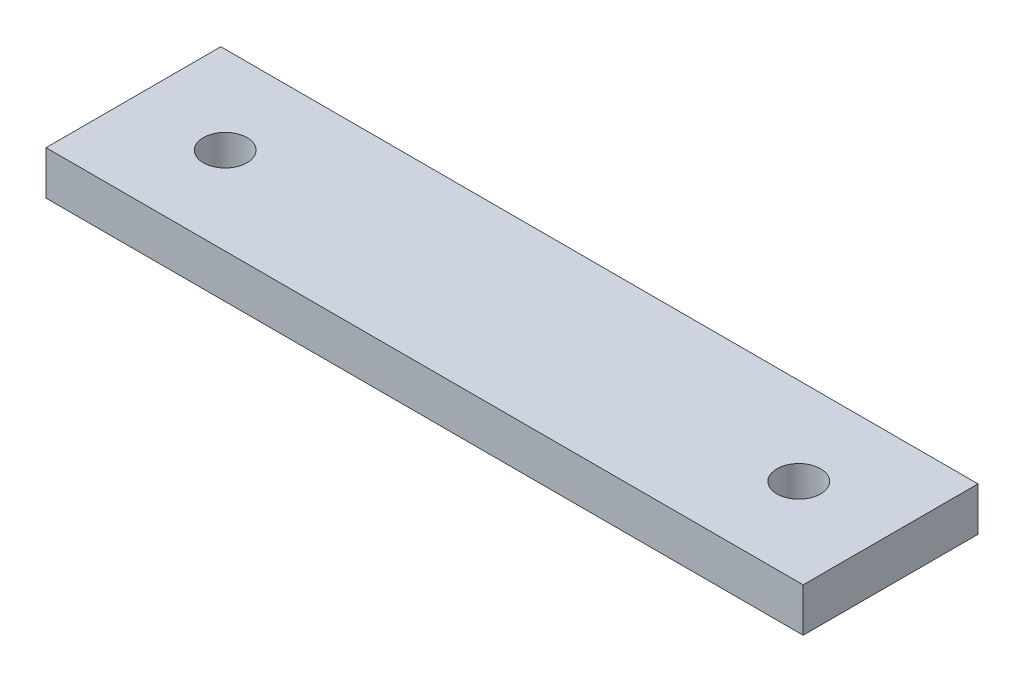
ISO-10303-21;
HEADER;
FILE_DESCRIPTION(('STEP AP214'),'2;1');
FILE_NAME('part.step','',(''),(''),'','','');
FILE_SCHEMA(('AUTOMOTIVE_DESIGN { 1 0 10303 214 1 1 1 1 }'));
ENDSEC;
DATA;
#1=APPLICATION_CONTEXT('core data for automotive mechanical design processes');
#2=APPLICATION_PROTOCOL_DEFINITION('international standard','automotive_design',2000,#1);
#3=PRODUCT_CONTEXT('',#1,'mechanical');
#4=PRODUCT('Part','Part','',(#3));
#5=PRODUCT_RELATED_PRODUCT_CATEGORY('part','',(#4));
#6=PRODUCT_DEFINITION_FORMATION('','',#4);
#7=PRODUCT_DEFINITION_CONTEXT('part definition',#1,'design');
#8=PRODUCT_DEFINITION('design','',#6,#7);
#9=PRODUCT_DEFINITION_SHAPE('','',#8);
#10=(LENGTH_UNIT() NAMED_UNIT(*) SI_UNIT(.MILLI.,.METRE.));
#11=(NAMED_UNIT(*) PLANE_ANGLE_UNIT() SI_UNIT($,.RADIAN.));
#12=(NAMED_UNIT(*) SI_UNIT($,.STERADIAN.) SOLID_ANGLE_UNIT());
#13=UNCERTAINTY_MEASURE_WITH_UNIT(LENGTH_MEASURE(1.E-05),#10,'distance_accuracy_value','');
#14=(GEOMETRIC_REPRESENTATION_CONTEXT(3) GLOBAL_UNCERTAINTY_ASSIGNED_CONTEXT((#13)) GLOBAL_UNIT_ASSIGNED_CONTEXT((#10,
#11,#12)) REPRESENTATION_CONTEXT('',''));
#15=CARTESIAN_POINT('',(0.,0.,0.));
#16=DIRECTION('',(0.,0.,1.));
#17=DIRECTION('',(1.,0.,0.));
#18=AXIS2_PLACEMENT_3D('',#15,#16,#17);
#19=CARTESIAN_POINT('',(0.,19.05,0.));
#20=DIRECTION('',(0.,-1.,0.));
#21=DIRECTION('',(0.,0.,-1.));
#22=AXIS2_PLACEMENT_3D('',#19,#20,#21);
#23=PLANE('',#22);
#24=DIRECTION('',(0.,0.,-1.));
#25=VECTOR('',#24,1.);
#26=CARTESIAN_POINT('',(165.,19.05,38.1));
#27=LINE('',#26,#25);
#28=CARTESIAN_POINT('',(165.,19.05,38.1));
#29=VERTEX_POINT('',#28);
#30=CARTESIAN_POINT('',(165.,19.05,-38.0999999999999));
#31=VERTEX_POINT('',#30);
#32=EDGE_CURVE('E97',#29,#31,#27,.T.);
#33=ORIENTED_EDGE('',*,*,#32,.T.);
#34=DIRECTION('',(-1.,0.,0.));
#35=VECTOR('',#34,1.);
#36=CARTESIAN_POINT('',(-165.,19.05,-38.1));
#37=LINE('',#36,#35);
#38=CARTESIAN_POINT('',(-165.,19.05,-38.1));
#39=VERTEX_POINT('',#38);
#40=EDGE_CURVE('E93',#31,#39,#37,.T.);
#41=ORIENTED_EDGE('',*,*,#40,.T.);
#42=DIRECTION('',(0.,0.,1.));
#43=VECTOR('',#42,1.);
#44=CARTESIAN_POINT('',(-165.,19.05,38.1));
#45=LINE('',#44,#43);
#46=CARTESIAN_POINT('',(-165.,19.05,38.1));
#47=VERTEX_POINT('',#46);
#48=EDGE_CURVE('E96',#39,#47,#45,.T.);
#49=ORIENTED_EDGE('',*,*,#48,.T.);
#50=DIRECTION('',(1.,0.,0.));
#51=VECTOR('',#50,1.);
#52=CARTESIAN_POINT('',(-165.,19.05,38.1));
#53=LINE('',#52,#51);
#54=EDGE_CURVE('E64',#47,#29,#53,.T.);
#55=ORIENTED_EDGE('',*,*,#54,.T.);
#56=EDGE_LOOP('',(#33,#41,#49,#55));
#57=FACE_BOUND('',#56,.T.);
#58=CARTESIAN_POINT('',(-125.,19.05,0.));
#59=DIRECTION('',(0.,1.,0.));
#60=DIRECTION('',(0.,0.,1.));
#61=AXIS2_PLACEMENT_3D('',#58,#59,#60);
#62=CIRCLE('',#61,9.52499999999999);
#63=CARTESIAN_POINT('',(-125.,19.05,-9.52499999999999));
#64=VERTEX_POINT('',#63);
#65=EDGE_CURVE('E119',#64,#64,#62,.T.);
#66=ORIENTED_EDGE('',*,*,#65,.F.);
#67=EDGE_LOOP('',(#66));
#68=FACE_BOUND('',#67,.T.);
#69=CARTESIAN_POINT('',(125.,19.05,0.));
#70=DIRECTION('',(0.,1.,0.));
#71=DIRECTION('',(0.,0.,1.));
#72=AXIS2_PLACEMENT_3D('',#69,#70,#71);
#73=CIRCLE('',#72,9.52500000000002);
#74=CARTESIAN_POINT('',(125.,19.05,-9.52500000000001));
#75=VERTEX_POINT('',#74);
#76=EDGE_CURVE('E139',#75,#75,#73,.T.);
#77=ORIENTED_EDGE('',*,*,#76,.F.);
#78=EDGE_LOOP('',(#77));
#79=FACE_BOUND('',#78,.T.);
#80=ADVANCED_FACE('F44',(#57,#68,#79),#23,.F.);
#81=CARTESIAN_POINT('',(0.,0.,0.));
#82=DIRECTION('',(0.,-1.,0.));
#83=DIRECTION('',(0.,0.,-1.));
#84=AXIS2_PLACEMENT_3D('',#81,#82,#83);
#85=PLANE('',#84);
#86=CARTESIAN_POINT('',(-125.,0.,0.));
#87=DIRECTION('',(0.,1.,0.));
#88=DIRECTION('',(0.,0.,1.));
#89=AXIS2_PLACEMENT_3D('',#86,#87,#88);
#90=CIRCLE('',#89,9.52499999999999);
#91=CARTESIAN_POINT('',(-125.,0.,-9.52499999999999));
#92=VERTEX_POINT('',#91);
#93=EDGE_CURVE('E136',#92,#92,#90,.T.);
#94=ORIENTED_EDGE('',*,*,#93,.T.);
#95=EDGE_LOOP('',(#94));
#96=FACE_BOUND('',#95,.T.);
#97=DIRECTION('',(0.,0.,-1.));
#98=VECTOR('',#97,1.);
#99=CARTESIAN_POINT('',(165.,0.,38.1));
#100=LINE('',#99,#98);
#101=CARTESIAN_POINT('',(165.,0.,38.1));
#102=VERTEX_POINT('',#101);
#103=CARTESIAN_POINT('',(165.,0.,-38.0999999999999));
#104=VERTEX_POINT('',#103);
#105=EDGE_CURVE('E114',#102,#104,#100,.T.);
#106=ORIENTED_EDGE('',*,*,#105,.F.);
#107=DIRECTION('',(1.,0.,0.));
#108=VECTOR('',#107,1.);
#109=CARTESIAN_POINT('',(-165.,0.,38.1));
#110=LINE('',#109,#108);
#111=CARTESIAN_POINT('',(-165.,0.,38.1));
#112=VERTEX_POINT('',#111);
#113=EDGE_CURVE('E86',#112,#102,#110,.T.);
#114=ORIENTED_EDGE('',*,*,#113,.F.);
#115=DIRECTION('',(0.,0.,1.));
#116=VECTOR('',#115,1.);
#117=CARTESIAN_POINT('',(-165.,0.,38.1));
#118=LINE('',#117,#116);
#119=CARTESIAN_POINT('',(-165.,0.,-38.1));
#120=VERTEX_POINT('',#119);
#121=EDGE_CURVE('E79',#120,#112,#118,.T.);
#122=ORIENTED_EDGE('',*,*,#121,.F.);
#123=DIRECTION('',(-1.,0.,0.));
#124=VECTOR('',#123,1.);
#125=CARTESIAN_POINT('',(-165.,0.,-38.1));
#126=LINE('',#125,#124);
#127=EDGE_CURVE('E104',#104,#120,#126,.T.);
#128=ORIENTED_EDGE('',*,*,#127,.F.);
#129=EDGE_LOOP('',(#106,#114,#122,#128));
#130=FACE_BOUND('',#129,.T.);
#131=CARTESIAN_POINT('',(125.,0.,0.));
#132=DIRECTION('',(0.,1.,0.));
#133=DIRECTION('',(0.,0.,1.));
#134=AXIS2_PLACEMENT_3D('',#131,#132,#133);
#135=CIRCLE('',#134,9.52500000000002);
#136=CARTESIAN_POINT('',(125.,0.,-9.52500000000001));
#137=VERTEX_POINT('',#136);
#138=EDGE_CURVE('E143',#137,#137,#135,.T.);
#139=ORIENTED_EDGE('',*,*,#138,.T.);
#140=EDGE_LOOP('',(#139));
#141=FACE_BOUND('',#140,.T.);
#142=ADVANCED_FACE('F131',(#96,#130,#141),#85,.T.);
#143=CARTESIAN_POINT('',(165.,19.05,38.1));
#144=DIRECTION('',(-1.,0.,0.));
#145=DIRECTION('',(0.,0.,1.));
#146=AXIS2_PLACEMENT_3D('',#143,#144,#145);
#147=PLANE('',#146);
#148=ORIENTED_EDGE('',*,*,#105,.T.);
#149=DIRECTION('',(0.,-1.,0.));
#150=VECTOR('',#149,1.);
#151=CARTESIAN_POINT('',(165.,19.05,-38.0999999999999));
#152=LINE('',#151,#150);
#153=EDGE_CURVE('E11',#31,#104,#152,.T.);
#154=ORIENTED_EDGE('',*,*,#153,.F.);
#155=ORIENTED_EDGE('',*,*,#32,.F.);
#156=DIRECTION('',(0.,-1.,0.));
#157=VECTOR('',#156,1.);
#158=CARTESIAN_POINT('',(165.,19.05,38.1));
#159=LINE('',#158,#157);
#160=EDGE_CURVE('E110',#29,#102,#159,.T.);
#161=ORIENTED_EDGE('',*,*,#160,.T.);
#162=EDGE_LOOP('',(#148,#154,#155,#161));
#163=FACE_BOUND('',#162,.T.);
#164=ADVANCED_FACE('F50',(#163),#147,.F.);
#165=CARTESIAN_POINT('',(-165.,19.05,-38.1));
#166=DIRECTION('',(0.,0.,1.));
#167=DIRECTION('',(1.,0.,0.));
#168=AXIS2_PLACEMENT_3D('',#165,#166,#167);
#169=PLANE('',#168);
#170=ORIENTED_EDGE('',*,*,#127,.T.);
#171=DIRECTION('',(0.,-1.,0.));
#172=VECTOR('',#171,1.);
#173=CARTESIAN_POINT('',(-165.,19.05,-38.1));
#174=LINE('',#173,#172);
#175=EDGE_CURVE('E54',#39,#120,#174,.T.);
#176=ORIENTED_EDGE('',*,*,#175,.F.);
#177=ORIENTED_EDGE('',*,*,#40,.F.);
#178=ORIENTED_EDGE('',*,*,#153,.T.);
#179=EDGE_LOOP('',(#170,#176,#177,#178));
#180=FACE_BOUND('',#179,.T.);
#181=ADVANCED_FACE('F105',(#180),#169,.F.);
#182=CARTESIAN_POINT('',(-165.,19.05,38.1));
#183=DIRECTION('',(1.,0.,0.));
#184=DIRECTION('',(0.,0.,-1.));
#185=AXIS2_PLACEMENT_3D('',#182,#183,#184);
#186=PLANE('',#185);
#187=ORIENTED_EDGE('',*,*,#121,.T.);
#188=DIRECTION('',(0.,-1.,0.));
#189=VECTOR('',#188,1.);
#190=CARTESIAN_POINT('',(-165.,19.05,38.1));
#191=LINE('',#190,#189);
#192=EDGE_CURVE('E103',#47,#112,#191,.T.);
#193=ORIENTED_EDGE('',*,*,#192,.F.);
#194=ORIENTED_EDGE('',*,*,#48,.F.);
#195=ORIENTED_EDGE('',*,*,#175,.T.);
#196=EDGE_LOOP('',(#187,#193,#194,#195));
#197=FACE_BOUND('',#196,.T.);
#198=ADVANCED_FACE('F106',(#197),#186,.F.);
#199=CARTESIAN_POINT('',(-165.,19.05,38.1));
#200=DIRECTION('',(0.,0.,-1.));
#201=DIRECTION('',(-1.,0.,0.));
#202=AXIS2_PLACEMENT_3D('',#199,#200,#201);
#203=PLANE('',#202);
#204=ORIENTED_EDGE('',*,*,#113,.T.);
#205=ORIENTED_EDGE('',*,*,#160,.F.);
#206=ORIENTED_EDGE('',*,*,#54,.F.);
#207=ORIENTED_EDGE('',*,*,#192,.T.);
#208=EDGE_LOOP('',(#204,#205,#206,#207));
#209=FACE_BOUND('',#208,.T.);
#210=ADVANCED_FACE('F126',(#209),#203,.F.);
#211=CARTESIAN_POINT('',(-125.,19.05,0.));
#212=DIRECTION('',(0.,-1.,0.));
#213=DIRECTION('',(0.,0.,-1.));
#214=AXIS2_PLACEMENT_3D('',#211,#212,#213);
#215=CYLINDRICAL_SURFACE('',#214,9.52499999999999);
#216=CARTESIAN_POINT('',(-125.,19.05,-9.52499999999999));
#217=CARTESIAN_POINT('',(-125.,18.8515625,-9.52499999999999));
#218=CARTESIAN_POINT('',(-125.,18.653125,-9.52499999999999));
#219=CARTESIAN_POINT('',(-125.,18.25625,-9.52499999999999));
#220=CARTESIAN_POINT('',(-125.,18.0578125,-9.52499999999999));
#221=CARTESIAN_POINT('',(-125.,17.6609375,-9.52499999999999));
#222=CARTESIAN_POINT('',(-125.,17.4625,-9.52499999999999));
#223=CARTESIAN_POINT('',(-125.,17.065625,-9.52499999999999));
#224=CARTESIAN_POINT('',(-125.,16.8671875,-9.52499999999999));
#225=CARTESIAN_POINT('',(-125.,16.4703125,-9.52499999999999));
#226=CARTESIAN_POINT('',(-125.,16.271875,-9.52499999999999));
#227=CARTESIAN_POINT('',(-125.,15.875,-9.52499999999999));
#228=CARTESIAN_POINT('',(-125.,15.6765625,-9.52499999999999));
#229=CARTESIAN_POINT('',(-125.,15.2796875,-9.52499999999999));
#230=CARTESIAN_POINT('',(-125.,15.08125,-9.52499999999999));
#231=CARTESIAN_POINT('',(-125.,14.684375,-9.52499999999999));
#232=CARTESIAN_POINT('',(-125.,14.4859375,-9.52499999999999));
#233=CARTESIAN_POINT('',(-125.,14.0890625,-9.52499999999999));
#234=CARTESIAN_POINT('',(-125.,13.890625,-9.52499999999999));
#235=CARTESIAN_POINT('',(-125.,13.49375,-9.52499999999999));
#236=CARTESIAN_POINT('',(-125.,13.2953125,-9.52499999999999));
#237=CARTESIAN_POINT('',(-125.,12.8984375,-9.52499999999999));
#238=CARTESIAN_POINT('',(-125.,12.7,-9.52499999999999));
#239=CARTESIAN_POINT('',(-125.,12.303125,-9.52499999999999));
#240=CARTESIAN_POINT('',(-125.,12.1046875,-9.52499999999999));
#241=CARTESIAN_POINT('',(-125.,11.7078125,-9.52499999999999));
#242=CARTESIAN_POINT('',(-125.,11.509375,-9.52499999999999));
#243=CARTESIAN_POINT('',(-125.,11.1125,-9.52499999999999));
#244=CARTESIAN_POINT('',(-125.,10.9140625,-9.52499999999999));
#245=CARTESIAN_POINT('',(-125.,10.5171875,-9.52499999999999));
#246=CARTESIAN_POINT('',(-125.,10.31875,-9.52499999999999));
#247=CARTESIAN_POINT('',(-125.,9.921875,-9.52499999999999));
#248=CARTESIAN_POINT('',(-125.,9.7234375,-9.52499999999999));
#249=CARTESIAN_POINT('',(-125.,9.3265625,-9.52499999999999));
#250=CARTESIAN_POINT('',(-125.,9.128125,-9.52499999999999));
#251=CARTESIAN_POINT('',(-125.,8.73125,-9.52499999999999));
#252=CARTESIAN_POINT('',(-125.,8.5328125,-9.52499999999999));
#253=CARTESIAN_POINT('',(-125.,8.1359375,-9.52499999999999));
#254=CARTESIAN_POINT('',(-125.,7.9375,-9.52499999999999));
#255=CARTESIAN_POINT('',(-125.,7.540625,-9.52499999999999));
#256=CARTESIAN_POINT('',(-125.,7.3421875,-9.52499999999999));
#257=CARTESIAN_POINT('',(-125.,6.9453125,-9.52499999999999));
#258=CARTESIAN_POINT('',(-125.,6.746875,-9.52499999999999));
#259=CARTESIAN_POINT('',(-125.,6.35,-9.52499999999999));
#260=CARTESIAN_POINT('',(-125.,6.1515625,-9.52499999999999));
#261=CARTESIAN_POINT('',(-125.,5.7546875,-9.52499999999999));
#262=CARTESIAN_POINT('',(-125.,5.55625,-9.52499999999999));
#263=CARTESIAN_POINT('',(-125.,5.159375,-9.52499999999999));
#264=CARTESIAN_POINT('',(-125.,4.9609375,-9.52499999999999));
#265=CARTESIAN_POINT('',(-125.,4.5640625,-9.52499999999999));
#266=CARTESIAN_POINT('',(-125.,4.365625,-9.52499999999999));
#267=CARTESIAN_POINT('',(-125.,3.96875,-9.52499999999999));
#268=CARTESIAN_POINT('',(-125.,3.7703125,-9.52499999999999));
#269=CARTESIAN_POINT('',(-125.,3.3734375,-9.52499999999999));
#270=CARTESIAN_POINT('',(-125.,3.175,-9.52499999999999));
#271=CARTESIAN_POINT('',(-125.,2.778125,-9.52499999999999));
#272=CARTESIAN_POINT('',(-125.,2.5796875,-9.52499999999999));
#273=CARTESIAN_POINT('',(-125.,2.1828125,-9.52499999999999));
#274=CARTESIAN_POINT('',(-125.,1.984375,-9.52499999999999));
#275=CARTESIAN_POINT('',(-125.,1.5875,-9.52499999999999));
#276=CARTESIAN_POINT('',(-125.,1.3890625,-9.52499999999999));
#277=CARTESIAN_POINT('',(-125.,0.992187500000001,-9.52499999999999));
#278=CARTESIAN_POINT('',(-125.,0.793750000000001,-9.52499999999999));
#279=CARTESIAN_POINT('',(-125.,0.396875,-9.52499999999999));
#280=CARTESIAN_POINT('',(-125.,0.1984375,-9.52499999999999));
#281=CARTESIAN_POINT('',(-125.,0.,-9.52499999999999));
#282=B_SPLINE_CURVE_WITH_KNOTS('',3,(#216,#217,#218,#219,#220,#221,#222,#223,#224,#225,#226,
#227,#228,#229,#230,#231,#232,#233,#234,#235,#236,#237,#238,#239,#240,#241,#242,#243,#244,#245,
#246,#247,#248,#249,#250,#251,#252,#253,#254,#255,#256,#257,#258,#259,#260,#261,#262,#263,#264,
#265,#266,#267,#268,#269,#270,#271,#272,#273,#274,#275,#276,#277,#278,#279,#280,#281),
.UNSPECIFIED.,.F.,.F.,(4,2,2,2,2,2,2,2,2,2,2,2,2,2,2,2,2,2,2,2,2,2,2,2,2,2,2,2,2,2,2,2,4),(0.,
0.5953125,1.190625,1.7859375,2.38125,2.9765625,3.571875,4.1671875,4.7625,5.3578125,5.953125,
6.5484375,7.14375,7.7390625,8.334375,8.9296875,9.525,10.1203125,10.715625,11.3109375,11.90625,
12.5015625,13.096875,13.6921875,14.2875,14.8828125,15.478125,16.0734375,16.66875,17.2640625,
17.859375,18.4546875,19.05),.UNSPECIFIED.);
#283=EDGE_CURVE('BSEAM164',#64,#92,#282,.T.);
#284=ORIENTED_EDGE('',*,*,#65,.T.);
#285=ORIENTED_EDGE('',*,*,#93,.F.);
#286=ORIENTED_EDGE('',*,*,#283,.T.);
#287=ORIENTED_EDGE('',*,*,#283,.F.);
#288=EDGE_LOOP('',(#284,#286,#285,#287));
#289=FACE_BOUND('',#288,.T.);
#290=ADVANCED_FACE('F164',(#289),#215,.F.);
#291=CARTESIAN_POINT('',(125.,19.05,0.));
#292=DIRECTION('',(0.,-1.,0.));
#293=DIRECTION('',(0.,0.,-1.));
#294=AXIS2_PLACEMENT_3D('',#291,#292,#293);
#295=CYLINDRICAL_SURFACE('',#294,9.52500000000002);
#296=CARTESIAN_POINT('',(125.,19.05,-9.52500000000001));
#297=CARTESIAN_POINT('',(125.,18.8515625,-9.52500000000001));
#298=CARTESIAN_POINT('',(125.,18.653125,-9.52500000000001));
#299=CARTESIAN_POINT('',(125.,18.25625,-9.52500000000001));
#300=CARTESIAN_POINT('',(125.,18.0578125,-9.52500000000001));
#301=CARTESIAN_POINT('',(125.,17.6609375,-9.52500000000001));
#302=CARTESIAN_POINT('',(125.,17.4625,-9.52500000000001));
#303=CARTESIAN_POINT('',(125.,17.065625,-9.52500000000001));
#304=CARTESIAN_POINT('',(125.,16.8671875,-9.52500000000001));
#305=CARTESIAN_POINT('',(125.,16.4703125,-9.52500000000001));
#306=CARTESIAN_POINT('',(125.,16.271875,-9.52500000000001));
#307=CARTESIAN_POINT('',(125.,15.875,-9.52500000000001));
#308=CARTESIAN_POINT('',(125.,15.6765625,-9.52500000000001));
#309=CARTESIAN_POINT('',(125.,15.2796875,-9.52500000000001));
#310=CARTESIAN_POINT('',(125.,15.08125,-9.52500000000001));
#311=CARTESIAN_POINT('',(125.,14.684375,-9.52500000000001));
#312=CARTESIAN_POINT('',(125.,14.4859375,-9.52500000000001));
#313=CARTESIAN_POINT('',(125.,14.0890625,-9.52500000000001));
#314=CARTESIAN_POINT('',(125.,13.890625,-9.52500000000001));
#315=CARTESIAN_POINT('',(125.,13.49375,-9.52500000000001));
#316=CARTESIAN_POINT('',(125.,13.2953125,-9.52500000000001));
#317=CARTESIAN_POINT('',(125.,12.8984375,-9.52500000000001));
#318=CARTESIAN_POINT('',(125.,12.7,-9.52500000000001));
#319=CARTESIAN_POINT('',(125.,12.303125,-9.52500000000001));
#320=CARTESIAN_POINT('',(125.,12.1046875,-9.52500000000001));
#321=CARTESIAN_POINT('',(125.,11.7078125,-9.52500000000001));
#322=CARTESIAN_POINT('',(125.,11.509375,-9.52500000000001));
#323=CARTESIAN_POINT('',(125.,11.1125,-9.52500000000001));
#324=CARTESIAN_POINT('',(125.,10.9140625,-9.52500000000001));
#325=CARTESIAN_POINT('',(125.,10.5171875,-9.52500000000001));
#326=CARTESIAN_POINT('',(125.,10.31875,-9.52500000000001));
#327=CARTESIAN_POINT('',(125.,9.921875,-9.52500000000001));
#328=CARTESIAN_POINT('',(125.,9.7234375,-9.52500000000001));
#329=CARTESIAN_POINT('',(125.,9.3265625,-9.52500000000001));
#330=CARTESIAN_POINT('',(125.,9.128125,-9.52500000000001));
#331=CARTESIAN_POINT('',(125.,8.73125,-9.52500000000001));
#332=CARTESIAN_POINT('',(125.,8.5328125,-9.52500000000001));
#333=CARTESIAN_POINT('',(125.,8.1359375,-9.52500000000001));
#334=CARTESIAN_POINT('',(125.,7.9375,-9.52500000000001));
#335=CARTESIAN_POINT('',(125.,7.540625,-9.52500000000001));
#336=CARTESIAN_POINT('',(125.,7.3421875,-9.52500000000001));
#337=CARTESIAN_POINT('',(125.,6.9453125,-9.52500000000001));
#338=CARTESIAN_POINT('',(125.,6.746875,-9.52500000000001));
#339=CARTESIAN_POINT('',(125.,6.35,-9.52500000000001));
#340=CARTESIAN_POINT('',(125.,6.1515625,-9.52500000000001));
#341=CARTESIAN_POINT('',(125.,5.7546875,-9.52500000000001));
#342=CARTESIAN_POINT('',(125.,5.55625,-9.52500000000001));
#343=CARTESIAN_POINT('',(125.,5.159375,-9.52500000000001));
#344=CARTESIAN_POINT('',(125.,4.9609375,-9.52500000000001));
#345=CARTESIAN_POINT('',(125.,4.5640625,-9.52500000000001));
#346=CARTESIAN_POINT('',(125.,4.365625,-9.52500000000001));
#347=CARTESIAN_POINT('',(125.,3.96875,-9.52500000000001));
#348=CARTESIAN_POINT('',(125.,3.7703125,-9.52500000000001));
#349=CARTESIAN_POINT('',(125.,3.3734375,-9.52500000000001));
#350=CARTESIAN_POINT('',(125.,3.175,-9.52500000000001));
#351=CARTESIAN_POINT('',(125.,2.778125,-9.52500000000001));
#352=CARTESIAN_POINT('',(125.,2.5796875,-9.52500000000001));
#353=CARTESIAN_POINT('',(125.,2.1828125,-9.52500000000001));
#354=CARTESIAN_POINT('',(125.,1.984375,-9.52500000000001));
#355=CARTESIAN_POINT('',(125.,1.5875,-9.52500000000001));
#356=CARTESIAN_POINT('',(125.,1.3890625,-9.52500000000001));
#357=CARTESIAN_POINT('',(125.,0.992187500000001,-9.52500000000001));
#358=CARTESIAN_POINT('',(125.,0.793750000000001,-9.52500000000001));
#359=CARTESIAN_POINT('',(125.,0.396875,-9.52500000000001));
#360=CARTESIAN_POINT('',(125.,0.1984375,-9.52500000000001));
#361=CARTESIAN_POINT('',(125.,0.,-9.52500000000001));
#362=B_SPLINE_CURVE_WITH_KNOTS('',3,(#296,#297,#298,#299,#300,#301,#302,#303,#304,#305,#306,
#307,#308,#309,#310,#311,#312,#313,#314,#315,#316,#317,#318,#319,#320,#321,#322,#323,#324,#325,
#326,#327,#328,#329,#330,#331,#332,#333,#334,#335,#336,#337,#338,#339,#340,#341,#342,#343,#344,
#345,#346,#347,#348,#349,#350,#351,#352,#353,#354,#355,#356,#357,#358,#359,#360,#361),
.UNSPECIFIED.,.F.,.F.,(4,2,2,2,2,2,2,2,2,2,2,2,2,2,2,2,2,2,2,2,2,2,2,2,2,2,2,2,2,2,2,2,4),(0.,
0.5953125,1.190625,1.7859375,2.38125,2.9765625,3.571875,4.1671875,4.7625,5.3578125,5.953125,
6.5484375,7.14375,7.7390625,8.334375,8.9296875,9.525,10.1203125,10.715625,11.3109375,11.90625,
12.5015625,13.096875,13.6921875,14.2875,14.8828125,15.478125,16.0734375,16.66875,17.2640625,
17.859375,18.4546875,19.05),.UNSPECIFIED.);
#363=EDGE_CURVE('BSEAM152',#75,#137,#362,.T.);
#364=ORIENTED_EDGE('',*,*,#76,.T.);
#365=ORIENTED_EDGE('',*,*,#138,.F.);
#366=ORIENTED_EDGE('',*,*,#363,.T.);
#367=ORIENTED_EDGE('',*,*,#363,.F.);
#368=EDGE_LOOP('',(#364,#366,#365,#367));
#369=FACE_BOUND('',#368,.T.);
#370=ADVANCED_FACE('F152',(#369),#295,.F.);
#371=CLOSED_SHELL('',(#80,#142,#164,#181,#198,#210,#290,#370));
#372=MANIFOLD_SOLID_BREP('B2',#371);
#373=ADVANCED_BREP_SHAPE_REPRESENTATION('',(#18,#372),#14);
#374=SHAPE_DEFINITION_REPRESENTATION(#9,#373);
ENDSEC;
END-ISO-10303-21;
